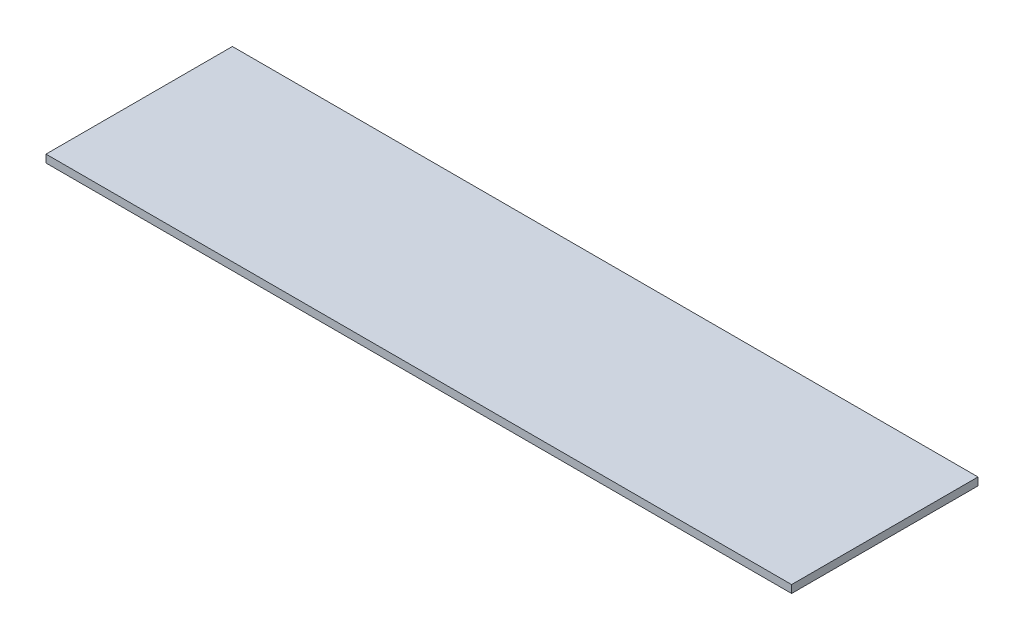
ISO-10303-21;
HEADER;
FILE_DESCRIPTION(('STEP AP214'),'2;1');
FILE_NAME('part.step','',(''),(''),'','','');
FILE_SCHEMA(('AUTOMOTIVE_DESIGN { 1 0 10303 214 1 1 1 1 }'));
ENDSEC;
DATA;
#1=APPLICATION_CONTEXT('core data for automotive mechanical design processes');
#2=APPLICATION_PROTOCOL_DEFINITION('international standard','automotive_design',2000,#1);
#3=PRODUCT_CONTEXT('',#1,'mechanical');
#4=PRODUCT('Part','Part','',(#3));
#5=PRODUCT_RELATED_PRODUCT_CATEGORY('part','',(#4));
#6=PRODUCT_DEFINITION_FORMATION('','',#4);
#7=PRODUCT_DEFINITION_CONTEXT('part definition',#1,'design');
#8=PRODUCT_DEFINITION('design','',#6,#7);
#9=PRODUCT_DEFINITION_SHAPE('','',#8);
#10=(LENGTH_UNIT() NAMED_UNIT(*) SI_UNIT(.MILLI.,.METRE.));
#11=(NAMED_UNIT(*) PLANE_ANGLE_UNIT() SI_UNIT($,.RADIAN.));
#12=(NAMED_UNIT(*) SI_UNIT($,.STERADIAN.) SOLID_ANGLE_UNIT());
#13=UNCERTAINTY_MEASURE_WITH_UNIT(LENGTH_MEASURE(1.E-05),#10,'distance_accuracy_value','');
#14=(GEOMETRIC_REPRESENTATION_CONTEXT(3) GLOBAL_UNCERTAINTY_ASSIGNED_CONTEXT((#13)) GLOBAL_UNIT_ASSIGNED_CONTEXT((#10,
#11,#12)) REPRESENTATION_CONTEXT('',''));
#15=CARTESIAN_POINT('',(0.,0.,0.));
#16=DIRECTION('',(0.,0.,1.));
#17=DIRECTION('',(1.,0.,0.));
#18=AXIS2_PLACEMENT_3D('',#15,#16,#17);
#19=CARTESIAN_POINT('',(304.8,3.175,76.2));
#20=DIRECTION('',(-1.,0.,0.));
#21=DIRECTION('',(0.,0.,1.));
#22=AXIS2_PLACEMENT_3D('',#19,#20,#21);
#23=PLANE('',#22);
#24=DIRECTION('',(0.,0.,-1.));
#25=VECTOR('',#24,1.);
#26=CARTESIAN_POINT('',(304.8,-3.175,76.2));
#27=LINE('',#26,#25);
#28=CARTESIAN_POINT('',(304.8,-3.175,76.2));
#29=VERTEX_POINT('',#28);
#30=CARTESIAN_POINT('',(304.8,-3.175,-76.2));
#31=VERTEX_POINT('',#30);
#32=EDGE_CURVE('E99',#29,#31,#27,.T.);
#33=ORIENTED_EDGE('',*,*,#32,.T.);
#34=DIRECTION('',(0.,-1.,0.));
#35=VECTOR('',#34,1.);
#36=CARTESIAN_POINT('',(304.8,3.175,-76.2));
#37=LINE('',#36,#35);
#38=CARTESIAN_POINT('',(304.8,3.175,-76.2));
#39=VERTEX_POINT('',#38);
#40=EDGE_CURVE('E11',#39,#31,#37,.T.);
#41=ORIENTED_EDGE('',*,*,#40,.F.);
#42=DIRECTION('',(0.,0.,-1.));
#43=VECTOR('',#42,1.);
#44=CARTESIAN_POINT('',(304.8,3.175,76.2));
#45=LINE('',#44,#43);
#46=CARTESIAN_POINT('',(304.8,3.175,76.2));
#47=VERTEX_POINT('',#46);
#48=EDGE_CURVE('E87',#47,#39,#45,.T.);
#49=ORIENTED_EDGE('',*,*,#48,.F.);
#50=DIRECTION('',(0.,-1.,0.));
#51=VECTOR('',#50,1.);
#52=CARTESIAN_POINT('',(304.8,3.175,76.2));
#53=LINE('',#52,#51);
#54=EDGE_CURVE('E95',#47,#29,#53,.T.);
#55=ORIENTED_EDGE('',*,*,#54,.T.);
#56=EDGE_LOOP('',(#33,#41,#49,#55));
#57=FACE_BOUND('',#56,.T.);
#58=ADVANCED_FACE('F36',(#57),#23,.F.);
#59=CARTESIAN_POINT('',(-304.8,3.175,-76.2));
#60=DIRECTION('',(0.,0.,1.));
#61=DIRECTION('',(1.,0.,0.));
#62=AXIS2_PLACEMENT_3D('',#59,#60,#61);
#63=PLANE('',#62);
#64=DIRECTION('',(-1.,0.,0.));
#65=VECTOR('',#64,1.);
#66=CARTESIAN_POINT('',(-304.8,-3.175,-76.2));
#67=LINE('',#66,#65);
#68=CARTESIAN_POINT('',(-304.8,-3.175,-76.2));
#69=VERTEX_POINT('',#68);
#70=EDGE_CURVE('E91',#31,#69,#67,.T.);
#71=ORIENTED_EDGE('',*,*,#70,.T.);
#72=DIRECTION('',(0.,-1.,0.));
#73=VECTOR('',#72,1.);
#74=CARTESIAN_POINT('',(-304.8,3.175,-76.2));
#75=LINE('',#74,#73);
#76=CARTESIAN_POINT('',(-304.8,3.175,-76.2));
#77=VERTEX_POINT('',#76);
#78=EDGE_CURVE('E44',#77,#69,#75,.T.);
#79=ORIENTED_EDGE('',*,*,#78,.F.);
#80=DIRECTION('',(-1.,0.,0.));
#81=VECTOR('',#80,1.);
#82=CARTESIAN_POINT('',(-304.8,3.175,-76.2));
#83=LINE('',#82,#81);
#84=EDGE_CURVE('E82',#39,#77,#83,.T.);
#85=ORIENTED_EDGE('',*,*,#84,.F.);
#86=ORIENTED_EDGE('',*,*,#40,.T.);
#87=EDGE_LOOP('',(#71,#79,#85,#86));
#88=FACE_BOUND('',#87,.T.);
#89=ADVANCED_FACE('F90',(#88),#63,.F.);
#90=CARTESIAN_POINT('',(-304.8,3.175,76.2));
#91=DIRECTION('',(1.,0.,0.));
#92=DIRECTION('',(0.,0.,-1.));
#93=AXIS2_PLACEMENT_3D('',#90,#91,#92);
#94=PLANE('',#93);
#95=DIRECTION('',(0.,0.,1.));
#96=VECTOR('',#95,1.);
#97=CARTESIAN_POINT('',(-304.8,-3.175,76.2));
#98=LINE('',#97,#96);
#99=CARTESIAN_POINT('',(-304.8,-3.175,76.2));
#100=VERTEX_POINT('',#99);
#101=EDGE_CURVE('E69',#69,#100,#98,.T.);
#102=ORIENTED_EDGE('',*,*,#101,.T.);
#103=DIRECTION('',(0.,-1.,0.));
#104=VECTOR('',#103,1.);
#105=CARTESIAN_POINT('',(-304.8,3.175,76.2));
#106=LINE('',#105,#104);
#107=CARTESIAN_POINT('',(-304.8,3.175,76.2));
#108=VERTEX_POINT('',#107);
#109=EDGE_CURVE('E92',#108,#100,#106,.T.);
#110=ORIENTED_EDGE('',*,*,#109,.F.);
#111=DIRECTION('',(0.,0.,1.));
#112=VECTOR('',#111,1.);
#113=CARTESIAN_POINT('',(-304.8,3.175,76.2));
#114=LINE('',#113,#112);
#115=EDGE_CURVE('E85',#77,#108,#114,.T.);
#116=ORIENTED_EDGE('',*,*,#115,.F.);
#117=ORIENTED_EDGE('',*,*,#78,.T.);
#118=EDGE_LOOP('',(#102,#110,#116,#117));
#119=FACE_BOUND('',#118,.T.);
#120=ADVANCED_FACE('F93',(#119),#94,.F.);
#121=CARTESIAN_POINT('',(-304.8,3.175,76.2));
#122=DIRECTION('',(0.,0.,-1.));
#123=DIRECTION('',(-1.,0.,0.));
#124=AXIS2_PLACEMENT_3D('',#121,#122,#123);
#125=PLANE('',#124);
#126=DIRECTION('',(1.,0.,0.));
#127=VECTOR('',#126,1.);
#128=CARTESIAN_POINT('',(-304.8,-3.175,76.2));
#129=LINE('',#128,#127);
#130=EDGE_CURVE('E75',#100,#29,#129,.T.);
#131=ORIENTED_EDGE('',*,*,#130,.T.);
#132=ORIENTED_EDGE('',*,*,#54,.F.);
#133=DIRECTION('',(1.,0.,0.));
#134=VECTOR('',#133,1.);
#135=CARTESIAN_POINT('',(-304.8,3.175,76.2));
#136=LINE('',#135,#134);
#137=EDGE_CURVE('E52',#108,#47,#136,.T.);
#138=ORIENTED_EDGE('',*,*,#137,.F.);
#139=ORIENTED_EDGE('',*,*,#109,.T.);
#140=EDGE_LOOP('',(#131,#132,#138,#139));
#141=FACE_BOUND('',#140,.T.);
#142=ADVANCED_FACE('F106',(#141),#125,.F.);
#143=CARTESIAN_POINT('',(0.,3.175,0.));
#144=DIRECTION('',(0.,-1.,0.));
#145=DIRECTION('',(0.,0.,-1.));
#146=AXIS2_PLACEMENT_3D('',#143,#144,#145);
#147=PLANE('',#146);
#148=ORIENTED_EDGE('',*,*,#48,.T.);
#149=ORIENTED_EDGE('',*,*,#84,.T.);
#150=ORIENTED_EDGE('',*,*,#115,.T.);
#151=ORIENTED_EDGE('',*,*,#137,.T.);
#152=EDGE_LOOP('',(#148,#149,#150,#151));
#153=FACE_BOUND('',#152,.T.);
#154=ADVANCED_FACE('F83',(#153),#147,.F.);
#155=CARTESIAN_POINT('',(0.,-3.175,0.));
#156=DIRECTION('',(0.,-1.,0.));
#157=DIRECTION('',(0.,0.,-1.));
#158=AXIS2_PLACEMENT_3D('',#155,#156,#157);
#159=PLANE('',#158);
#160=ORIENTED_EDGE('',*,*,#32,.F.);
#161=ORIENTED_EDGE('',*,*,#130,.F.);
#162=ORIENTED_EDGE('',*,*,#101,.F.);
#163=ORIENTED_EDGE('',*,*,#70,.F.);
#164=EDGE_LOOP('',(#160,#161,#162,#163));
#165=FACE_BOUND('',#164,.T.);
#166=ADVANCED_FACE('F109',(#165),#159,.T.);
#167=CLOSED_SHELL('',(#58,#89,#120,#142,#154,#166));
#168=MANIFOLD_SOLID_BREP('B2',#167);
#169=ADVANCED_BREP_SHAPE_REPRESENTATION('',(#18,#168),#14);
#170=SHAPE_DEFINITION_REPRESENTATION(#9,#169);
ENDSEC;
END-ISO-10303-21;
